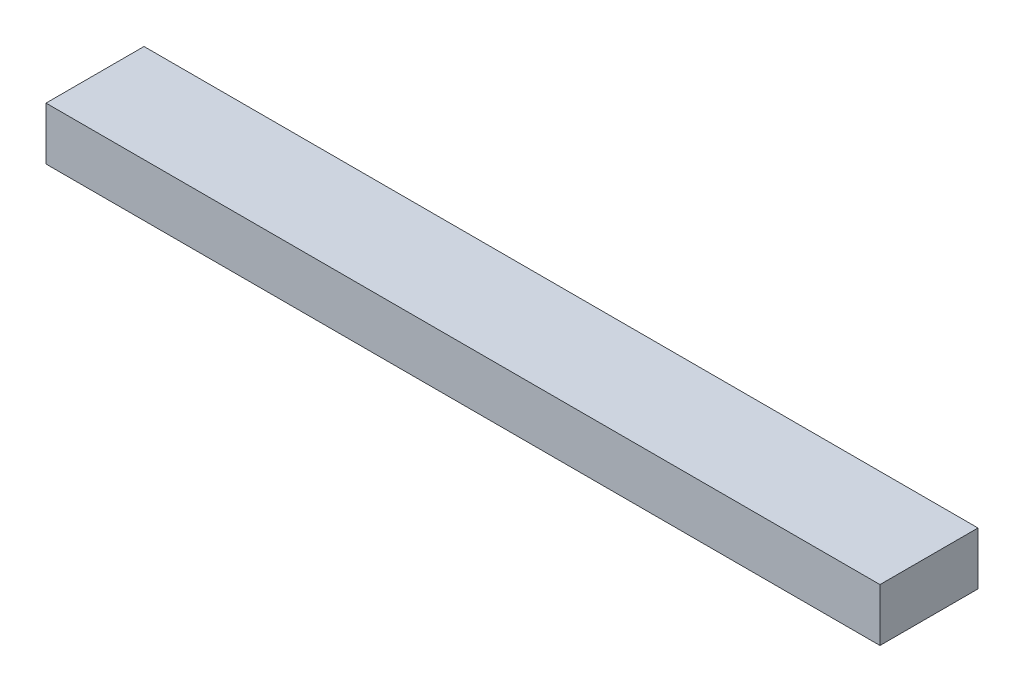
ISO-10303-21;
HEADER;
FILE_DESCRIPTION(('STEP AP214'),'2;1');
FILE_NAME('part.step','',(''),(''),'','','');
FILE_SCHEMA(('AUTOMOTIVE_DESIGN { 1 0 10303 214 1 1 1 1 }'));
ENDSEC;
DATA;
#1=APPLICATION_CONTEXT('core data for automotive mechanical design processes');
#2=APPLICATION_PROTOCOL_DEFINITION('international standard','automotive_design',2000,#1);
#3=PRODUCT_CONTEXT('',#1,'mechanical');
#4=PRODUCT('Part','Part','',(#3));
#5=PRODUCT_RELATED_PRODUCT_CATEGORY('part','',(#4));
#6=PRODUCT_DEFINITION_FORMATION('','',#4);
#7=PRODUCT_DEFINITION_CONTEXT('part definition',#1,'design');
#8=PRODUCT_DEFINITION('design','',#6,#7);
#9=PRODUCT_DEFINITION_SHAPE('','',#8);
#10=(LENGTH_UNIT() NAMED_UNIT(*) SI_UNIT(.MILLI.,.METRE.));
#11=(NAMED_UNIT(*) PLANE_ANGLE_UNIT() SI_UNIT($,.RADIAN.));
#12=(NAMED_UNIT(*) SI_UNIT($,.STERADIAN.) SOLID_ANGLE_UNIT());
#13=UNCERTAINTY_MEASURE_WITH_UNIT(LENGTH_MEASURE(1.E-05),#10,'distance_accuracy_value','');
#14=(GEOMETRIC_REPRESENTATION_CONTEXT(3) GLOBAL_UNCERTAINTY_ASSIGNED_CONTEXT((#13)) GLOBAL_UNIT_ASSIGNED_CONTEXT((#10,
#11,#12)) REPRESENTATION_CONTEXT('',''));
#15=CARTESIAN_POINT('',(0.,0.,0.));
#16=DIRECTION('',(0.,0.,1.));
#17=DIRECTION('',(1.,0.,0.));
#18=AXIS2_PLACEMENT_3D('',#15,#16,#17);
#19=CARTESIAN_POINT('',(-53.6830409356725,7.,-21.9906432748538));
#20=DIRECTION('',(1.,0.,0.));
#21=DIRECTION('',(0.,0.,-1.));
#22=AXIS2_PLACEMENT_3D('',#19,#20,#21);
#23=PLANE('',#22);
#24=DIRECTION('',(0.,0.,1.));
#25=VECTOR('',#24,1.);
#26=CARTESIAN_POINT('',(-53.6830409356725,0.,-21.9906432748538));
#27=LINE('',#26,#25);
#28=CARTESIAN_POINT('',(-53.6830409356725,0.,-21.9906432748538));
#29=VERTEX_POINT('',#28);
#30=CARTESIAN_POINT('',(-53.6830409356725,0.,-8.9906432748538));
#31=VERTEX_POINT('',#30);
#32=EDGE_CURVE('E98',#29,#31,#27,.T.);
#33=ORIENTED_EDGE('',*,*,#32,.T.);
#34=DIRECTION('',(0.,-1.,0.));
#35=VECTOR('',#34,1.);
#36=CARTESIAN_POINT('',(-53.6830409356725,7.,-8.9906432748538));
#37=LINE('',#36,#35);
#38=CARTESIAN_POINT('',(-53.6830409356725,7.,-8.9906432748538));
#39=VERTEX_POINT('',#38);
#40=EDGE_CURVE('E11',#39,#31,#37,.T.);
#41=ORIENTED_EDGE('',*,*,#40,.F.);
#42=DIRECTION('',(0.,0.,1.));
#43=VECTOR('',#42,1.);
#44=CARTESIAN_POINT('',(-53.6830409356725,7.,-21.9906432748538));
#45=LINE('',#44,#43);
#46=CARTESIAN_POINT('',(-53.6830409356725,7.,-21.9906432748538));
#47=VERTEX_POINT('',#46);
#48=EDGE_CURVE('E84',#47,#39,#45,.T.);
#49=ORIENTED_EDGE('',*,*,#48,.F.);
#50=DIRECTION('',(0.,-1.,0.));
#51=VECTOR('',#50,1.);
#52=CARTESIAN_POINT('',(-53.6830409356725,7.,-21.9906432748538));
#53=LINE('',#52,#51);
#54=EDGE_CURVE('E51',#47,#29,#53,.T.);
#55=ORIENTED_EDGE('',*,*,#54,.T.);
#56=EDGE_LOOP('',(#33,#41,#49,#55));
#57=FACE_BOUND('',#56,.T.);
#58=ADVANCED_FACE('F35',(#57),#23,.F.);
#59=CARTESIAN_POINT('',(-53.6830409356725,7.,-8.9906432748538));
#60=DIRECTION('',(0.,0.,-1.));
#61=DIRECTION('',(-1.,0.,0.));
#62=AXIS2_PLACEMENT_3D('',#59,#60,#61);
#63=PLANE('',#62);
#64=DIRECTION('',(1.,0.,0.));
#65=VECTOR('',#64,1.);
#66=CARTESIAN_POINT('',(-53.6830409356725,0.,-8.9906432748538));
#67=LINE('',#66,#65);
#68=CARTESIAN_POINT('',(56.9169590643275,0.,-8.9906432748538));
#69=VERTEX_POINT('',#68);
#70=EDGE_CURVE('E89',#31,#69,#67,.T.);
#71=ORIENTED_EDGE('',*,*,#70,.T.);
#72=DIRECTION('',(0.,-1.,0.));
#73=VECTOR('',#72,1.);
#74=CARTESIAN_POINT('',(56.9169590643275,7.,-8.9906432748538));
#75=LINE('',#74,#73);
#76=CARTESIAN_POINT('',(56.9169590643275,7.,-8.9906432748538));
#77=VERTEX_POINT('',#76);
#78=EDGE_CURVE('E43',#77,#69,#75,.T.);
#79=ORIENTED_EDGE('',*,*,#78,.F.);
#80=DIRECTION('',(1.,0.,0.));
#81=VECTOR('',#80,1.);
#82=CARTESIAN_POINT('',(-53.6830409356725,7.,-8.9906432748538));
#83=LINE('',#82,#81);
#84=EDGE_CURVE('E76',#39,#77,#83,.T.);
#85=ORIENTED_EDGE('',*,*,#84,.F.);
#86=ORIENTED_EDGE('',*,*,#40,.T.);
#87=EDGE_LOOP('',(#71,#79,#85,#86));
#88=FACE_BOUND('',#87,.T.);
#89=ADVANCED_FACE('F88',(#88),#63,.F.);
#90=CARTESIAN_POINT('',(56.9169590643275,7.,-21.9906432748538));
#91=DIRECTION('',(1.,0.,0.));
#92=DIRECTION('',(0.,0.,-1.));
#93=AXIS2_PLACEMENT_3D('',#90,#91,#92);
#94=PLANE('',#93);
#95=DIRECTION('',(0.,0.,1.));
#96=VECTOR('',#95,1.);
#97=CARTESIAN_POINT('',(56.9169590643275,0.,-21.9906432748538));
#98=LINE('',#97,#96);
#99=CARTESIAN_POINT('',(56.9169590643275,0.,-21.9906432748538));
#100=VERTEX_POINT('',#99);
#101=EDGE_CURVE('E101',#100,#69,#98,.T.);
#102=ORIENTED_EDGE('',*,*,#101,.F.);
#103=DIRECTION('',(0.,-1.,0.));
#104=VECTOR('',#103,1.);
#105=CARTESIAN_POINT('',(56.9169590643275,7.,-21.9906432748538));
#106=LINE('',#105,#104);
#107=CARTESIAN_POINT('',(56.9169590643275,7.,-21.9906432748538));
#108=VERTEX_POINT('',#107);
#109=EDGE_CURVE('E65',#108,#100,#106,.T.);
#110=ORIENTED_EDGE('',*,*,#109,.F.);
#111=DIRECTION('',(0.,0.,1.));
#112=VECTOR('',#111,1.);
#113=CARTESIAN_POINT('',(56.9169590643275,7.,-21.9906432748538));
#114=LINE('',#113,#112);
#115=EDGE_CURVE('E83',#108,#77,#114,.T.);
#116=ORIENTED_EDGE('',*,*,#115,.T.);
#117=ORIENTED_EDGE('',*,*,#78,.T.);
#118=EDGE_LOOP('',(#102,#110,#116,#117));
#119=FACE_BOUND('',#118,.T.);
#120=ADVANCED_FACE('F92',(#119),#94,.T.);
#121=CARTESIAN_POINT('',(-53.6830409356725,7.,-21.9906432748538));
#122=DIRECTION('',(0.,0.,-1.));
#123=DIRECTION('',(-1.,0.,0.));
#124=AXIS2_PLACEMENT_3D('',#121,#122,#123);
#125=PLANE('',#124);
#126=DIRECTION('',(1.,0.,0.));
#127=VECTOR('',#126,1.);
#128=CARTESIAN_POINT('',(-53.6830409356725,0.,-21.9906432748538));
#129=LINE('',#128,#127);
#130=EDGE_CURVE('E103',#29,#100,#129,.T.);
#131=ORIENTED_EDGE('',*,*,#130,.F.);
#132=ORIENTED_EDGE('',*,*,#54,.F.);
#133=DIRECTION('',(1.,0.,0.));
#134=VECTOR('',#133,1.);
#135=CARTESIAN_POINT('',(-53.6830409356725,7.,-21.9906432748538));
#136=LINE('',#135,#134);
#137=EDGE_CURVE('E93',#47,#108,#136,.T.);
#138=ORIENTED_EDGE('',*,*,#137,.T.);
#139=ORIENTED_EDGE('',*,*,#109,.T.);
#140=EDGE_LOOP('',(#131,#132,#138,#139));
#141=FACE_BOUND('',#140,.T.);
#142=ADVANCED_FACE('F109',(#141),#125,.T.);
#143=CARTESIAN_POINT('',(0.,7.,0.));
#144=DIRECTION('',(0.,1.,0.));
#145=DIRECTION('',(0.,0.,1.));
#146=AXIS2_PLACEMENT_3D('',#143,#144,#145);
#147=PLANE('',#146);
#148=ORIENTED_EDGE('',*,*,#48,.T.);
#149=ORIENTED_EDGE('',*,*,#84,.T.);
#150=ORIENTED_EDGE('',*,*,#115,.F.);
#151=ORIENTED_EDGE('',*,*,#137,.F.);
#152=EDGE_LOOP('',(#148,#149,#150,#151));
#153=FACE_BOUND('',#152,.T.);
#154=ADVANCED_FACE('F80',(#153),#147,.T.);
#155=CARTESIAN_POINT('',(0.,0.,0.));
#156=DIRECTION('',(0.,1.,0.));
#157=DIRECTION('',(0.,0.,1.));
#158=AXIS2_PLACEMENT_3D('',#155,#156,#157);
#159=PLANE('',#158);
#160=ORIENTED_EDGE('',*,*,#32,.F.);
#161=ORIENTED_EDGE('',*,*,#130,.T.);
#162=ORIENTED_EDGE('',*,*,#101,.T.);
#163=ORIENTED_EDGE('',*,*,#70,.F.);
#164=EDGE_LOOP('',(#160,#161,#162,#163));
#165=FACE_BOUND('',#164,.T.);
#166=ADVANCED_FACE('F108',(#165),#159,.F.);
#167=CLOSED_SHELL('',(#58,#89,#120,#142,#154,#166));
#168=MANIFOLD_SOLID_BREP('B2',#167);
#169=ADVANCED_BREP_SHAPE_REPRESENTATION('',(#18,#168),#14);
#170=SHAPE_DEFINITION_REPRESENTATION(#9,#169);
ENDSEC;
END-ISO-10303-21;
